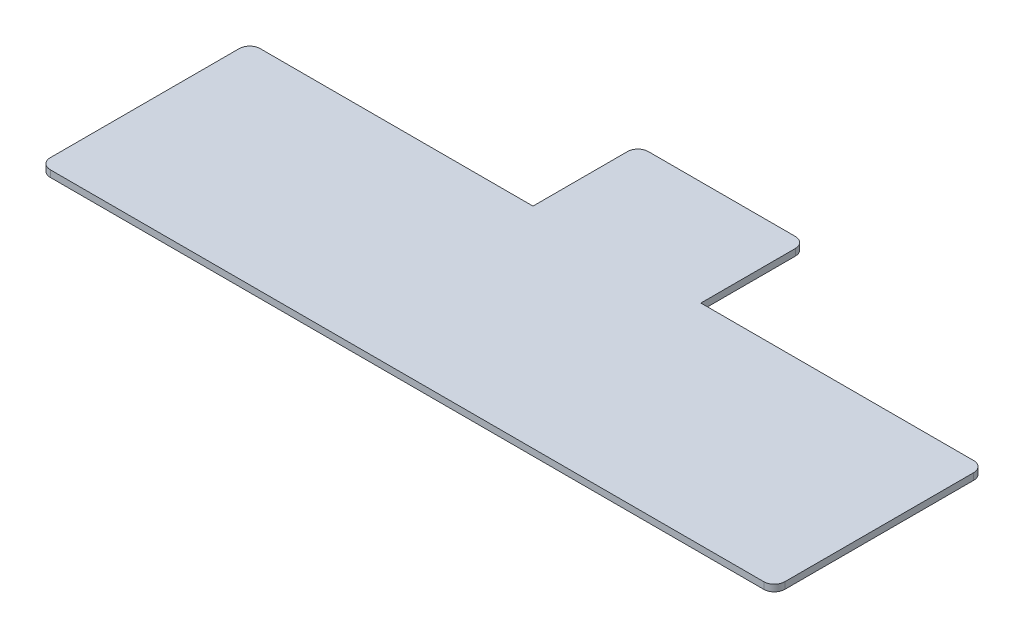
ISO-10303-21;
HEADER;
FILE_DESCRIPTION(('STEP AP214'),'2;1');
FILE_NAME('part.step','',(''),(''),'','','');
FILE_SCHEMA(('AUTOMOTIVE_DESIGN { 1 0 10303 214 1 1 1 1 }'));
ENDSEC;
DATA;
#1=APPLICATION_CONTEXT('core data for automotive mechanical design processes');
#2=APPLICATION_PROTOCOL_DEFINITION('international standard','automotive_design',2000,#1);
#3=PRODUCT_CONTEXT('',#1,'mechanical');
#4=PRODUCT('Part','Part','',(#3));
#5=PRODUCT_RELATED_PRODUCT_CATEGORY('part','',(#4));
#6=PRODUCT_DEFINITION_FORMATION('','',#4);
#7=PRODUCT_DEFINITION_CONTEXT('part definition',#1,'design');
#8=PRODUCT_DEFINITION('design','',#6,#7);
#9=PRODUCT_DEFINITION_SHAPE('','',#8);
#10=(LENGTH_UNIT() NAMED_UNIT(*) SI_UNIT(.MILLI.,.METRE.));
#11=(NAMED_UNIT(*) PLANE_ANGLE_UNIT() SI_UNIT($,.RADIAN.));
#12=(NAMED_UNIT(*) SI_UNIT($,.STERADIAN.) SOLID_ANGLE_UNIT());
#13=UNCERTAINTY_MEASURE_WITH_UNIT(LENGTH_MEASURE(1.E-05),#10,'distance_accuracy_value','');
#14=(GEOMETRIC_REPRESENTATION_CONTEXT(3) GLOBAL_UNCERTAINTY_ASSIGNED_CONTEXT((#13)) GLOBAL_UNIT_ASSIGNED_CONTEXT((#10,
#11,#12)) REPRESENTATION_CONTEXT('',''));
#15=CARTESIAN_POINT('',(0.,0.,0.));
#16=DIRECTION('',(0.,0.,1.));
#17=DIRECTION('',(1.,0.,0.));
#18=AXIS2_PLACEMENT_3D('',#15,#16,#17);
#19=CARTESIAN_POINT('',(0.,-3.175,0.));
#20=DIRECTION('',(-1.,0.,0.));
#21=DIRECTION('',(0.,0.,1.));
#22=AXIS2_PLACEMENT_3D('',#19,#20,#21);
#23=PLANE('',#22);
#24=DIRECTION('',(0.,0.,1.));
#25=VECTOR('',#24,1.);
#26=CARTESIAN_POINT('',(0.,-3.175,0.));
#27=LINE('',#26,#25);
#28=CARTESIAN_POINT('',(0.,-3.175,-95.));
#29=VERTEX_POINT('',#28);
#30=CARTESIAN_POINT('',(0.,-3.175,-5.));
#31=VERTEX_POINT('',#30);
#32=EDGE_CURVE('E190',#29,#31,#27,.T.);
#33=ORIENTED_EDGE('',*,*,#32,.T.);
#34=DIRECTION('',(0.,1.,0.));
#35=VECTOR('',#34,1.);
#36=CARTESIAN_POINT('',(0.,-3.175,-5.));
#37=LINE('',#36,#35);
#38=CARTESIAN_POINT('',(0.,0.,-5.));
#39=VERTEX_POINT('',#38);
#40=EDGE_CURVE('E228',#31,#39,#37,.T.);
#41=ORIENTED_EDGE('',*,*,#40,.T.);
#42=DIRECTION('',(0.,0.,1.));
#43=VECTOR('',#42,1.);
#44=CARTESIAN_POINT('',(0.,0.,0.));
#45=LINE('',#44,#43);
#46=CARTESIAN_POINT('',(0.,0.,-95.));
#47=VERTEX_POINT('',#46);
#48=EDGE_CURVE('E170',#47,#39,#45,.T.);
#49=ORIENTED_EDGE('',*,*,#48,.F.);
#50=DIRECTION('',(0.,1.,0.));
#51=VECTOR('',#50,1.);
#52=CARTESIAN_POINT('',(0.,-3.175,-95.));
#53=LINE('',#52,#51);
#54=EDGE_CURVE('E226',#47,#29,#53,.F.);
#55=ORIENTED_EDGE('',*,*,#54,.T.);
#56=EDGE_LOOP('',(#33,#41,#49,#55));
#57=FACE_BOUND('',#56,.T.);
#58=ADVANCED_FACE('F39',(#57),#23,.T.);
#59=CARTESIAN_POINT('',(0.,-3.175,-100.));
#60=DIRECTION('',(0.,0.,-1.));
#61=DIRECTION('',(-1.,0.,0.));
#62=AXIS2_PLACEMENT_3D('',#59,#60,#61);
#63=PLANE('',#62);
#64=DIRECTION('',(-1.,0.,0.));
#65=VECTOR('',#64,1.);
#66=CARTESIAN_POINT('',(0.,-3.175,-100.));
#67=LINE('',#66,#65);
#68=CARTESIAN_POINT('',(135.,-3.175,-100.));
#69=VERTEX_POINT('',#68);
#70=CARTESIAN_POINT('',(5.,-3.175,-100.));
#71=VERTEX_POINT('',#70);
#72=EDGE_CURVE('E156',#69,#71,#67,.T.);
#73=ORIENTED_EDGE('',*,*,#72,.T.);
#74=DIRECTION('',(0.,1.,0.));
#75=VECTOR('',#74,1.);
#76=CARTESIAN_POINT('',(5.,-3.175,-100.));
#77=LINE('',#76,#75);
#78=CARTESIAN_POINT('',(5.,0.,-100.));
#79=VERTEX_POINT('',#78);
#80=EDGE_CURVE('E11',#71,#79,#77,.T.);
#81=ORIENTED_EDGE('',*,*,#80,.T.);
#82=DIRECTION('',(-1.,0.,0.));
#83=VECTOR('',#82,1.);
#84=CARTESIAN_POINT('',(0.,0.,-100.));
#85=LINE('',#84,#83);
#86=CARTESIAN_POINT('',(135.,0.,-100.));
#87=VERTEX_POINT('',#86);
#88=EDGE_CURVE('E187',#87,#79,#85,.T.);
#89=ORIENTED_EDGE('',*,*,#88,.F.);
#90=DIRECTION('',(0.,1.,0.));
#91=VECTOR('',#90,1.);
#92=CARTESIAN_POINT('',(135.,-3.175,-100.));
#93=LINE('',#92,#91);
#94=EDGE_CURVE('E155',#69,#87,#93,.T.);
#95=ORIENTED_EDGE('',*,*,#94,.F.);
#96=EDGE_LOOP('',(#73,#81,#89,#95));
#97=FACE_BOUND('',#96,.T.);
#98=ADVANCED_FACE('F285',(#97),#63,.T.);
#99=CARTESIAN_POINT('',(135.,-3.175,-100.));
#100=DIRECTION('',(-1.,0.,0.));
#101=DIRECTION('',(0.,0.,1.));
#102=AXIS2_PLACEMENT_3D('',#99,#100,#101);
#103=PLANE('',#102);
#104=DIRECTION('',(0.,0.,1.));
#105=VECTOR('',#104,1.);
#106=CARTESIAN_POINT('',(135.,0.,-100.));
#107=LINE('',#106,#105);
#108=CARTESIAN_POINT('',(135.,0.,-145.));
#109=VERTEX_POINT('',#108);
#110=EDGE_CURVE('E185',#109,#87,#107,.T.);
#111=ORIENTED_EDGE('',*,*,#110,.F.);
#112=DIRECTION('',(0.,1.,0.));
#113=VECTOR('',#112,1.);
#114=CARTESIAN_POINT('',(135.,-3.175,-145.));
#115=LINE('',#114,#113);
#116=CARTESIAN_POINT('',(135.,-3.175,-145.));
#117=VERTEX_POINT('',#116);
#118=EDGE_CURVE('E236',#109,#117,#115,.F.);
#119=ORIENTED_EDGE('',*,*,#118,.T.);
#120=DIRECTION('',(0.,0.,1.));
#121=VECTOR('',#120,1.);
#122=CARTESIAN_POINT('',(135.,-3.175,-100.));
#123=LINE('',#122,#121);
#124=EDGE_CURVE('E163',#117,#69,#123,.T.);
#125=ORIENTED_EDGE('',*,*,#124,.T.);
#126=ORIENTED_EDGE('',*,*,#94,.T.);
#127=EDGE_LOOP('',(#111,#119,#125,#126));
#128=FACE_BOUND('',#127,.T.);
#129=ADVANCED_FACE('F289',(#128),#103,.T.);
#130=CARTESIAN_POINT('',(135.,-3.175,-150.));
#131=DIRECTION('',(0.,0.,-1.));
#132=DIRECTION('',(-1.,0.,0.));
#133=AXIS2_PLACEMENT_3D('',#130,#131,#132);
#134=PLANE('',#133);
#135=DIRECTION('',(-1.,0.,0.));
#136=VECTOR('',#135,1.);
#137=CARTESIAN_POINT('',(135.,-3.175,-150.));
#138=LINE('',#137,#136);
#139=CARTESIAN_POINT('',(210.,-3.175,-150.));
#140=VERTEX_POINT('',#139);
#141=CARTESIAN_POINT('',(140.,-3.175,-150.));
#142=VERTEX_POINT('',#141);
#143=EDGE_CURVE('E160',#140,#142,#138,.T.);
#144=ORIENTED_EDGE('',*,*,#143,.T.);
#145=DIRECTION('',(0.,1.,0.));
#146=VECTOR('',#145,1.);
#147=CARTESIAN_POINT('',(140.,-3.175,-150.));
#148=LINE('',#147,#146);
#149=CARTESIAN_POINT('',(140.,0.,-150.));
#150=VERTEX_POINT('',#149);
#151=EDGE_CURVE('E233',#142,#150,#148,.T.);
#152=ORIENTED_EDGE('',*,*,#151,.T.);
#153=DIRECTION('',(-1.,0.,0.));
#154=VECTOR('',#153,1.);
#155=CARTESIAN_POINT('',(135.,0.,-150.));
#156=LINE('',#155,#154);
#157=CARTESIAN_POINT('',(210.,0.,-150.));
#158=VERTEX_POINT('',#157);
#159=EDGE_CURVE('E182',#158,#150,#156,.T.);
#160=ORIENTED_EDGE('',*,*,#159,.F.);
#161=DIRECTION('',(0.,1.,0.));
#162=VECTOR('',#161,1.);
#163=CARTESIAN_POINT('',(210.,-3.175,-150.));
#164=LINE('',#163,#162);
#165=EDGE_CURVE('E231',#158,#140,#164,.F.);
#166=ORIENTED_EDGE('',*,*,#165,.T.);
#167=EDGE_LOOP('',(#144,#152,#160,#166));
#168=FACE_BOUND('',#167,.T.);
#169=ADVANCED_FACE('F301',(#168),#134,.T.);
#170=CARTESIAN_POINT('',(215.,-3.175,-100.));
#171=DIRECTION('',(1.,0.,0.));
#172=DIRECTION('',(0.,0.,-1.));
#173=AXIS2_PLACEMENT_3D('',#170,#171,#172);
#174=PLANE('',#173);
#175=DIRECTION('',(0.,0.,-1.));
#176=VECTOR('',#175,1.);
#177=CARTESIAN_POINT('',(215.,-3.175,-100.));
#178=LINE('',#177,#176);
#179=CARTESIAN_POINT('',(215.,-3.175,-100.));
#180=VERTEX_POINT('',#179);
#181=CARTESIAN_POINT('',(215.,-3.175,-145.));
#182=VERTEX_POINT('',#181);
#183=EDGE_CURVE('E146',#180,#182,#178,.T.);
#184=ORIENTED_EDGE('',*,*,#183,.T.);
#185=DIRECTION('',(0.,1.,0.));
#186=VECTOR('',#185,1.);
#187=CARTESIAN_POINT('',(215.,-3.175,-145.));
#188=LINE('',#187,#186);
#189=CARTESIAN_POINT('',(215.,0.,-145.));
#190=VERTEX_POINT('',#189);
#191=EDGE_CURVE('E238',#182,#190,#188,.T.);
#192=ORIENTED_EDGE('',*,*,#191,.T.);
#193=DIRECTION('',(0.,0.,-1.));
#194=VECTOR('',#193,1.);
#195=CARTESIAN_POINT('',(215.,0.,-100.));
#196=LINE('',#195,#194);
#197=CARTESIAN_POINT('',(215.,0.,-100.));
#198=VERTEX_POINT('',#197);
#199=EDGE_CURVE('E154',#198,#190,#196,.T.);
#200=ORIENTED_EDGE('',*,*,#199,.F.);
#201=DIRECTION('',(0.,1.,0.));
#202=VECTOR('',#201,1.);
#203=CARTESIAN_POINT('',(215.,-3.175,-100.));
#204=LINE('',#203,#202);
#205=EDGE_CURVE('E143',#180,#198,#204,.T.);
#206=ORIENTED_EDGE('',*,*,#205,.F.);
#207=EDGE_LOOP('',(#184,#192,#200,#206));
#208=FACE_BOUND('',#207,.T.);
#209=ADVANCED_FACE('F150',(#208),#174,.T.);
#210=CARTESIAN_POINT('',(215.,-3.175,-100.));
#211=DIRECTION('',(0.,0.,-1.));
#212=DIRECTION('',(-1.,0.,0.));
#213=AXIS2_PLACEMENT_3D('',#210,#211,#212);
#214=PLANE('',#213);
#215=DIRECTION('',(-1.,0.,0.));
#216=VECTOR('',#215,1.);
#217=CARTESIAN_POINT('',(215.,0.,-100.));
#218=LINE('',#217,#216);
#219=CARTESIAN_POINT('',(345.,0.,-100.));
#220=VERTEX_POINT('',#219);
#221=EDGE_CURVE('E179',#220,#198,#218,.T.);
#222=ORIENTED_EDGE('',*,*,#221,.F.);
#223=DIRECTION('',(0.,1.,0.));
#224=VECTOR('',#223,1.);
#225=CARTESIAN_POINT('',(345.,-3.175,-100.));
#226=LINE('',#225,#224);
#227=CARTESIAN_POINT('',(345.,-3.175,-100.));
#228=VERTEX_POINT('',#227);
#229=EDGE_CURVE('E47',#220,#228,#226,.F.);
#230=ORIENTED_EDGE('',*,*,#229,.T.);
#231=DIRECTION('',(-1.,0.,0.));
#232=VECTOR('',#231,1.);
#233=CARTESIAN_POINT('',(215.,-3.175,-100.));
#234=LINE('',#233,#232);
#235=EDGE_CURVE('E140',#228,#180,#234,.T.);
#236=ORIENTED_EDGE('',*,*,#235,.T.);
#237=ORIENTED_EDGE('',*,*,#205,.T.);
#238=EDGE_LOOP('',(#222,#230,#236,#237));
#239=FACE_BOUND('',#238,.T.);
#240=ADVANCED_FACE('F142',(#239),#214,.T.);
#241=CARTESIAN_POINT('',(350.,-3.175,0.));
#242=DIRECTION('',(1.,0.,0.));
#243=DIRECTION('',(0.,0.,-1.));
#244=AXIS2_PLACEMENT_3D('',#241,#242,#243);
#245=PLANE('',#244);
#246=DIRECTION('',(0.,0.,-1.));
#247=VECTOR('',#246,1.);
#248=CARTESIAN_POINT('',(350.,0.,0.));
#249=LINE('',#248,#247);
#250=CARTESIAN_POINT('',(350.,0.,-5.));
#251=VERTEX_POINT('',#250);
#252=CARTESIAN_POINT('',(350.,0.,-95.));
#253=VERTEX_POINT('',#252);
#254=EDGE_CURVE('E176',#251,#253,#249,.T.);
#255=ORIENTED_EDGE('',*,*,#254,.F.);
#256=DIRECTION('',(0.,1.,0.));
#257=VECTOR('',#256,1.);
#258=CARTESIAN_POINT('',(350.,-3.175,-5.));
#259=LINE('',#258,#257);
#260=CARTESIAN_POINT('',(350.,-3.175,-5.));
#261=VERTEX_POINT('',#260);
#262=EDGE_CURVE('E213',#251,#261,#259,.F.);
#263=ORIENTED_EDGE('',*,*,#262,.T.);
#264=DIRECTION('',(0.,0.,-1.));
#265=VECTOR('',#264,1.);
#266=CARTESIAN_POINT('',(350.,-3.175,0.));
#267=LINE('',#266,#265);
#268=CARTESIAN_POINT('',(350.,-3.175,-95.));
#269=VERTEX_POINT('',#268);
#270=EDGE_CURVE('E147',#261,#269,#267,.T.);
#271=ORIENTED_EDGE('',*,*,#270,.T.);
#272=DIRECTION('',(0.,1.,0.));
#273=VECTOR('',#272,1.);
#274=CARTESIAN_POINT('',(350.,-3.175,-95.));
#275=LINE('',#274,#273);
#276=EDGE_CURVE('E210',#269,#253,#275,.T.);
#277=ORIENTED_EDGE('',*,*,#276,.T.);
#278=EDGE_LOOP('',(#255,#263,#271,#277));
#279=FACE_BOUND('',#278,.T.);
#280=ADVANCED_FACE('F250',(#279),#245,.T.);
#281=CARTESIAN_POINT('',(0.,-3.175,0.));
#282=DIRECTION('',(0.,0.,1.));
#283=DIRECTION('',(1.,0.,0.));
#284=AXIS2_PLACEMENT_3D('',#281,#282,#283);
#285=PLANE('',#284);
#286=DIRECTION('',(1.,0.,0.));
#287=VECTOR('',#286,1.);
#288=CARTESIAN_POINT('',(0.,-3.175,0.));
#289=LINE('',#288,#287);
#290=CARTESIAN_POINT('',(5.,-3.175,0.));
#291=VERTEX_POINT('',#290);
#292=CARTESIAN_POINT('',(345.,-3.175,0.));
#293=VERTEX_POINT('',#292);
#294=EDGE_CURVE('E252',#291,#293,#289,.T.);
#295=ORIENTED_EDGE('',*,*,#294,.T.);
#296=DIRECTION('',(0.,1.,0.));
#297=VECTOR('',#296,1.);
#298=CARTESIAN_POINT('',(345.,-3.175,0.));
#299=LINE('',#298,#297);
#300=CARTESIAN_POINT('',(345.,0.,0.));
#301=VERTEX_POINT('',#300);
#302=EDGE_CURVE('E195',#293,#301,#299,.T.);
#303=ORIENTED_EDGE('',*,*,#302,.T.);
#304=DIRECTION('',(1.,0.,0.));
#305=VECTOR('',#304,1.);
#306=CARTESIAN_POINT('',(0.,0.,0.));
#307=LINE('',#306,#305);
#308=CARTESIAN_POINT('',(5.,0.,0.));
#309=VERTEX_POINT('',#308);
#310=EDGE_CURVE('E173',#309,#301,#307,.T.);
#311=ORIENTED_EDGE('',*,*,#310,.F.);
#312=DIRECTION('',(0.,1.,0.));
#313=VECTOR('',#312,1.);
#314=CARTESIAN_POINT('',(5.,-3.175,0.));
#315=LINE('',#314,#313);
#316=EDGE_CURVE('E192',#309,#291,#315,.F.);
#317=ORIENTED_EDGE('',*,*,#316,.T.);
#318=EDGE_LOOP('',(#295,#303,#311,#317));
#319=FACE_BOUND('',#318,.T.);
#320=ADVANCED_FACE('F269',(#319),#285,.T.);
#321=CARTESIAN_POINT('',(0.,-3.175,0.));
#322=DIRECTION('',(0.,-1.,0.));
#323=DIRECTION('',(0.,0.,-1.));
#324=AXIS2_PLACEMENT_3D('',#321,#322,#323);
#325=PLANE('',#324);
#326=ORIENTED_EDGE('',*,*,#270,.F.);
#327=CARTESIAN_POINT('',(345.,-3.175,-5.));
#328=DIRECTION('',(0.,-1.,0.));
#329=DIRECTION('',(0.,0.,-1.));
#330=AXIS2_PLACEMENT_3D('',#327,#328,#329);
#331=CIRCLE('',#330,5.);
#332=EDGE_CURVE('E224',#261,#293,#331,.T.);
#333=ORIENTED_EDGE('',*,*,#332,.T.);
#334=ORIENTED_EDGE('',*,*,#294,.F.);
#335=CARTESIAN_POINT('',(5.,-3.175,-5.));
#336=DIRECTION('',(0.,-1.,0.));
#337=DIRECTION('',(0.,0.,-1.));
#338=AXIS2_PLACEMENT_3D('',#335,#336,#337);
#339=CIRCLE('',#338,5.);
#340=EDGE_CURVE('E222',#291,#31,#339,.T.);
#341=ORIENTED_EDGE('',*,*,#340,.T.);
#342=ORIENTED_EDGE('',*,*,#32,.F.);
#343=CARTESIAN_POINT('',(5.,-3.175,-95.));
#344=DIRECTION('',(0.,-1.,0.));
#345=DIRECTION('',(0.,0.,-1.));
#346=AXIS2_PLACEMENT_3D('',#343,#344,#345);
#347=CIRCLE('',#346,5.);
#348=EDGE_CURVE('E215',#29,#71,#347,.T.);
#349=ORIENTED_EDGE('',*,*,#348,.T.);
#350=ORIENTED_EDGE('',*,*,#72,.F.);
#351=ORIENTED_EDGE('',*,*,#124,.F.);
#352=CARTESIAN_POINT('',(140.,-3.175,-145.));
#353=DIRECTION('',(0.,-1.,0.));
#354=DIRECTION('',(0.,0.,-1.));
#355=AXIS2_PLACEMENT_3D('',#352,#353,#354);
#356=CIRCLE('',#355,5.);
#357=EDGE_CURVE('E220',#117,#142,#356,.T.);
#358=ORIENTED_EDGE('',*,*,#357,.T.);
#359=ORIENTED_EDGE('',*,*,#143,.F.);
#360=CARTESIAN_POINT('',(210.,-3.175,-145.));
#361=DIRECTION('',(0.,-1.,0.));
#362=DIRECTION('',(0.,0.,-1.));
#363=AXIS2_PLACEMENT_3D('',#360,#361,#362);
#364=CIRCLE('',#363,5.);
#365=EDGE_CURVE('E61',#140,#182,#364,.T.);
#366=ORIENTED_EDGE('',*,*,#365,.T.);
#367=ORIENTED_EDGE('',*,*,#183,.F.);
#368=ORIENTED_EDGE('',*,*,#235,.F.);
#369=CARTESIAN_POINT('',(345.,-3.175,-95.));
#370=DIRECTION('',(0.,-1.,0.));
#371=DIRECTION('',(0.,0.,-1.));
#372=AXIS2_PLACEMENT_3D('',#369,#370,#371);
#373=CIRCLE('',#372,5.);
#374=EDGE_CURVE('E217',#228,#269,#373,.T.);
#375=ORIENTED_EDGE('',*,*,#374,.T.);
#376=EDGE_LOOP('',(#326,#333,#334,#341,#342,#349,#350,#351,#358,#359,#366,#367,#368,#375));
#377=FACE_BOUND('',#376,.T.);
#378=ADVANCED_FACE('F159',(#377),#325,.T.);
#379=CARTESIAN_POINT('',(0.,0.,0.));
#380=DIRECTION('',(0.,-1.,0.));
#381=DIRECTION('',(0.,0.,-1.));
#382=AXIS2_PLACEMENT_3D('',#379,#380,#381);
#383=PLANE('',#382);
#384=ORIENTED_EDGE('',*,*,#310,.T.);
#385=CARTESIAN_POINT('',(345.,0.,-5.));
#386=DIRECTION('',(0.,-1.,0.));
#387=DIRECTION('',(0.,0.,-1.));
#388=AXIS2_PLACEMENT_3D('',#385,#386,#387);
#389=CIRCLE('',#388,5.);
#390=EDGE_CURVE('E208',#301,#251,#389,.F.);
#391=ORIENTED_EDGE('',*,*,#390,.T.);
#392=ORIENTED_EDGE('',*,*,#254,.T.);
#393=CARTESIAN_POINT('',(345.,0.,-95.));
#394=DIRECTION('',(0.,-1.,0.));
#395=DIRECTION('',(0.,0.,-1.));
#396=AXIS2_PLACEMENT_3D('',#393,#394,#395);
#397=CIRCLE('',#396,5.);
#398=EDGE_CURVE('E200',#253,#220,#397,.F.);
#399=ORIENTED_EDGE('',*,*,#398,.T.);
#400=ORIENTED_EDGE('',*,*,#221,.T.);
#401=ORIENTED_EDGE('',*,*,#199,.T.);
#402=CARTESIAN_POINT('',(210.,0.,-145.));
#403=DIRECTION('',(0.,-1.,0.));
#404=DIRECTION('',(0.,0.,-1.));
#405=AXIS2_PLACEMENT_3D('',#402,#403,#404);
#406=CIRCLE('',#405,5.);
#407=EDGE_CURVE('E202',#190,#158,#406,.F.);
#408=ORIENTED_EDGE('',*,*,#407,.T.);
#409=ORIENTED_EDGE('',*,*,#159,.T.);
#410=CARTESIAN_POINT('',(140.,0.,-145.));
#411=DIRECTION('',(0.,-1.,0.));
#412=DIRECTION('',(0.,0.,-1.));
#413=AXIS2_PLACEMENT_3D('',#410,#411,#412);
#414=CIRCLE('',#413,5.);
#415=EDGE_CURVE('E204',#150,#109,#414,.F.);
#416=ORIENTED_EDGE('',*,*,#415,.T.);
#417=ORIENTED_EDGE('',*,*,#110,.T.);
#418=ORIENTED_EDGE('',*,*,#88,.T.);
#419=CARTESIAN_POINT('',(5.,0.,-95.));
#420=DIRECTION('',(0.,-1.,0.));
#421=DIRECTION('',(0.,0.,-1.));
#422=AXIS2_PLACEMENT_3D('',#419,#420,#421);
#423=CIRCLE('',#422,5.);
#424=EDGE_CURVE('E198',#79,#47,#423,.F.);
#425=ORIENTED_EDGE('',*,*,#424,.T.);
#426=ORIENTED_EDGE('',*,*,#48,.T.);
#427=CARTESIAN_POINT('',(5.,0.,-5.));
#428=DIRECTION('',(0.,-1.,0.));
#429=DIRECTION('',(0.,0.,-1.));
#430=AXIS2_PLACEMENT_3D('',#427,#428,#429);
#431=CIRCLE('',#430,5.);
#432=EDGE_CURVE('E206',#39,#309,#431,.F.);
#433=ORIENTED_EDGE('',*,*,#432,.T.);
#434=EDGE_LOOP('',(#384,#391,#392,#399,#400,#401,#408,#409,#416,#417,#418,#425,#426,#433));
#435=FACE_BOUND('',#434,.T.);
#436=ADVANCED_FACE('F241',(#435),#383,.F.);
#437=CARTESIAN_POINT('',(345.,-3.175,-5.));
#438=DIRECTION('',(0.,1.,0.));
#439=DIRECTION('',(0.,0.,1.));
#440=AXIS2_PLACEMENT_3D('',#437,#438,#439);
#441=CYLINDRICAL_SURFACE('',#440,5.);
#442=ORIENTED_EDGE('',*,*,#332,.F.);
#443=ORIENTED_EDGE('',*,*,#262,.F.);
#444=ORIENTED_EDGE('',*,*,#390,.F.);
#445=ORIENTED_EDGE('',*,*,#302,.F.);
#446=EDGE_LOOP('',(#442,#443,#444,#445));
#447=FACE_BOUND('',#446,.T.);
#448=ADVANCED_FACE('F273',(#447),#441,.T.);
#449=CARTESIAN_POINT('',(5.,-3.175,-5.));
#450=DIRECTION('',(0.,1.,0.));
#451=DIRECTION('',(0.,0.,1.));
#452=AXIS2_PLACEMENT_3D('',#449,#450,#451);
#453=CYLINDRICAL_SURFACE('',#452,5.);
#454=ORIENTED_EDGE('',*,*,#340,.F.);
#455=ORIENTED_EDGE('',*,*,#316,.F.);
#456=ORIENTED_EDGE('',*,*,#432,.F.);
#457=ORIENTED_EDGE('',*,*,#40,.F.);
#458=EDGE_LOOP('',(#454,#455,#456,#457));
#459=FACE_BOUND('',#458,.T.);
#460=ADVANCED_FACE('F265',(#459),#453,.T.);
#461=CARTESIAN_POINT('',(140.,-3.175,-145.));
#462=DIRECTION('',(0.,1.,0.));
#463=DIRECTION('',(0.,0.,1.));
#464=AXIS2_PLACEMENT_3D('',#461,#462,#463);
#465=CYLINDRICAL_SURFACE('',#464,5.);
#466=ORIENTED_EDGE('',*,*,#357,.F.);
#467=ORIENTED_EDGE('',*,*,#118,.F.);
#468=ORIENTED_EDGE('',*,*,#415,.F.);
#469=ORIENTED_EDGE('',*,*,#151,.F.);
#470=EDGE_LOOP('',(#466,#467,#468,#469));
#471=FACE_BOUND('',#470,.T.);
#472=ADVANCED_FACE('F280',(#471),#465,.T.);
#473=CARTESIAN_POINT('',(210.,-3.175,-145.));
#474=DIRECTION('',(0.,1.,0.));
#475=DIRECTION('',(0.,0.,1.));
#476=AXIS2_PLACEMENT_3D('',#473,#474,#475);
#477=CYLINDRICAL_SURFACE('',#476,5.);
#478=ORIENTED_EDGE('',*,*,#365,.F.);
#479=ORIENTED_EDGE('',*,*,#165,.F.);
#480=ORIENTED_EDGE('',*,*,#407,.F.);
#481=ORIENTED_EDGE('',*,*,#191,.F.);
#482=EDGE_LOOP('',(#478,#479,#480,#481));
#483=FACE_BOUND('',#482,.T.);
#484=ADVANCED_FACE('F337',(#483),#477,.T.);
#485=CARTESIAN_POINT('',(345.,-3.175,-95.));
#486=DIRECTION('',(0.,1.,0.));
#487=DIRECTION('',(0.,0.,1.));
#488=AXIS2_PLACEMENT_3D('',#485,#486,#487);
#489=CYLINDRICAL_SURFACE('',#488,5.);
#490=ORIENTED_EDGE('',*,*,#374,.F.);
#491=ORIENTED_EDGE('',*,*,#229,.F.);
#492=ORIENTED_EDGE('',*,*,#398,.F.);
#493=ORIENTED_EDGE('',*,*,#276,.F.);
#494=EDGE_LOOP('',(#490,#491,#492,#493));
#495=FACE_BOUND('',#494,.T.);
#496=ADVANCED_FACE('F244',(#495),#489,.T.);
#497=CARTESIAN_POINT('',(5.,-3.175,-95.));
#498=DIRECTION('',(0.,1.,0.));
#499=DIRECTION('',(0.,0.,1.));
#500=AXIS2_PLACEMENT_3D('',#497,#498,#499);
#501=CYLINDRICAL_SURFACE('',#500,5.);
#502=ORIENTED_EDGE('',*,*,#348,.F.);
#503=ORIENTED_EDGE('',*,*,#54,.F.);
#504=ORIENTED_EDGE('',*,*,#424,.F.);
#505=ORIENTED_EDGE('',*,*,#80,.F.);
#506=EDGE_LOOP('',(#502,#503,#504,#505));
#507=FACE_BOUND('',#506,.T.);
#508=ADVANCED_FACE('F41',(#507),#501,.T.);
#509=CLOSED_SHELL('',(#58,#98,#129,#169,#209,#240,#280,#320,#378,#436,#448,#460,#472,#484,#496,#508));
#510=MANIFOLD_SOLID_BREP('B2',#509);
#511=ADVANCED_BREP_SHAPE_REPRESENTATION('',(#18,#510),#14);
#512=SHAPE_DEFINITION_REPRESENTATION(#9,#511);
ENDSEC;
END-ISO-10303-21;
